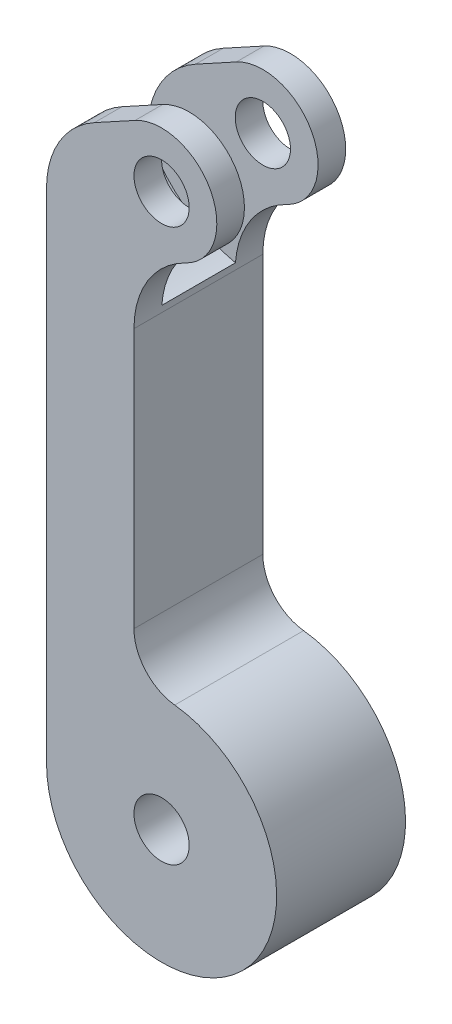
ISO-10303-21;
HEADER;
FILE_DESCRIPTION(('STEP AP214'),'2;1');
FILE_NAME('part.step','',(''),(''),'','','');
FILE_SCHEMA(('AUTOMOTIVE_DESIGN { 1 0 10303 214 1 1 1 1 }'));
ENDSEC;
DATA;
#1=APPLICATION_CONTEXT('core data for automotive mechanical design processes');
#2=APPLICATION_PROTOCOL_DEFINITION('international standard','automotive_design',2000,#1);
#3=PRODUCT_CONTEXT('',#1,'mechanical');
#4=PRODUCT('Part','Part','',(#3));
#5=PRODUCT_RELATED_PRODUCT_CATEGORY('part','',(#4));
#6=PRODUCT_DEFINITION_FORMATION('','',#4);
#7=PRODUCT_DEFINITION_CONTEXT('part definition',#1,'design');
#8=PRODUCT_DEFINITION('design','',#6,#7);
#9=PRODUCT_DEFINITION_SHAPE('','',#8);
#10=(LENGTH_UNIT() NAMED_UNIT(*) SI_UNIT(.MILLI.,.METRE.));
#11=(NAMED_UNIT(*) PLANE_ANGLE_UNIT() SI_UNIT($,.RADIAN.));
#12=(NAMED_UNIT(*) SI_UNIT($,.STERADIAN.) SOLID_ANGLE_UNIT());
#13=UNCERTAINTY_MEASURE_WITH_UNIT(LENGTH_MEASURE(1.E-05),#10,'distance_accuracy_value','');
#14=(GEOMETRIC_REPRESENTATION_CONTEXT(3) GLOBAL_UNCERTAINTY_ASSIGNED_CONTEXT((#13)) GLOBAL_UNIT_ASSIGNED_CONTEXT((#10,
#11,#12)) REPRESENTATION_CONTEXT('',''));
#15=CARTESIAN_POINT('',(0.,0.,0.));
#16=DIRECTION('',(0.,0.,1.));
#17=DIRECTION('',(1.,0.,0.));
#18=AXIS2_PLACEMENT_3D('',#15,#16,#17);
#19=CARTESIAN_POINT('',(0.,60.,14.));
#20=DIRECTION('',(0.,0.,-1.));
#21=DIRECTION('',(-1.,0.,0.));
#22=AXIS2_PLACEMENT_3D('',#19,#20,#21);
#23=CYLINDRICAL_SURFACE('',#22,6.);
#24=CARTESIAN_POINT('',(0.,60.,3.));
#25=DIRECTION('',(0.,0.,1.));
#26=DIRECTION('',(1.,0.,0.));
#27=AXIS2_PLACEMENT_3D('',#24,#25,#26);
#28=CIRCLE('',#27,6.);
#29=CARTESIAN_POINT('',(2.625,54.6046895362732,3.));
#30=VERTEX_POINT('',#29);
#31=CARTESIAN_POINT('',(-2.88,65.2636109278707,3.));
#32=VERTEX_POINT('',#31);
#33=EDGE_CURVE('E165',#30,#32,#28,.T.);
#34=ORIENTED_EDGE('',*,*,#33,.F.);
#35=DIRECTION('',(0.,0.,-1.));
#36=VECTOR('',#35,1.);
#37=CARTESIAN_POINT('',(2.625,54.6046895362732,14.));
#38=LINE('',#37,#36);
#39=CARTESIAN_POINT('',(2.625,54.6046895362732,0.));
#40=VERTEX_POINT('',#39);
#41=EDGE_CURVE('E233',#30,#40,#38,.T.);
#42=ORIENTED_EDGE('',*,*,#41,.T.);
#43=CARTESIAN_POINT('',(0.,60.,0.));
#44=DIRECTION('',(0.,0.,1.));
#45=DIRECTION('',(1.,0.,0.));
#46=AXIS2_PLACEMENT_3D('',#43,#44,#45);
#47=CIRCLE('',#46,6.);
#48=CARTESIAN_POINT('',(-2.88,65.2636109278707,0.));
#49=VERTEX_POINT('',#48);
#50=EDGE_CURVE('E204',#40,#49,#47,.T.);
#51=ORIENTED_EDGE('',*,*,#50,.T.);
#52=DIRECTION('',(0.,0.,-1.));
#53=VECTOR('',#52,1.);
#54=CARTESIAN_POINT('',(-2.88,65.2636109278707,14.));
#55=LINE('',#54,#53);
#56=EDGE_CURVE('E219',#32,#49,#55,.T.);
#57=ORIENTED_EDGE('',*,*,#56,.F.);
#58=EDGE_LOOP('',(#34,#42,#51,#57));
#59=FACE_BOUND('',#58,.T.);
#60=ADVANCED_FACE('F35',(#59),#23,.T.);
#61=CARTESIAN_POINT('',(-28.1453324537794,51.4396109278707,14.));
#62=DIRECTION('',(-0.48,0.877268487978452,0.));
#63=DIRECTION('',(-0.877268487978452,-0.48,0.));
#64=AXIS2_PLACEMENT_3D('',#61,#62,#63);
#65=PLANE('',#64);
#66=DIRECTION('',(0.,0.,-1.));
#67=VECTOR('',#66,1.);
#68=CARTESIAN_POINT('',(-7.3,62.8451950961463,14.));
#69=LINE('',#68,#67);
#70=CARTESIAN_POINT('',(-7.3,62.8451950961463,0.));
#71=VERTEX_POINT('',#70);
#72=CARTESIAN_POINT('',(-7.29999999999999,62.8451950961463,3.));
#73=VERTEX_POINT('',#72);
#74=EDGE_CURVE('E228',#71,#73,#69,.F.);
#75=ORIENTED_EDGE('',*,*,#74,.T.);
#76=DIRECTION('',(0.877268487978452,0.48,0.));
#77=VECTOR('',#76,1.);
#78=CARTESIAN_POINT('',(-28.1453324537794,51.4396109278707,3.));
#79=LINE('',#78,#77);
#80=EDGE_CURVE('E172',#73,#32,#79,.T.);
#81=ORIENTED_EDGE('',*,*,#80,.T.);
#82=ORIENTED_EDGE('',*,*,#56,.T.);
#83=DIRECTION('',(0.877268487978452,0.48,0.));
#84=VECTOR('',#83,1.);
#85=CARTESIAN_POINT('',(-28.1453324537794,51.4396109278707,0.));
#86=LINE('',#85,#84);
#87=EDGE_CURVE('E207',#71,#49,#86,.T.);
#88=ORIENTED_EDGE('',*,*,#87,.F.);
#89=EDGE_LOOP('',(#75,#81,#82,#88));
#90=FACE_BOUND('',#89,.T.);
#91=ADVANCED_FACE('F293',(#90),#65,.T.);
#92=CARTESIAN_POINT('',(0.,60.,14.));
#93=DIRECTION('',(0.,0.,-1.));
#94=DIRECTION('',(-1.,0.,0.));
#95=AXIS2_PLACEMENT_3D('',#92,#93,#94);
#96=CYLINDRICAL_SURFACE('',#95,3.);
#97=CARTESIAN_POINT('',(0.,60.,0.));
#98=DIRECTION('',(0.,0.,1.));
#99=DIRECTION('',(1.,0.,0.));
#100=AXIS2_PLACEMENT_3D('',#97,#98,#99);
#101=CIRCLE('',#100,3.);
#102=CARTESIAN_POINT('',(3.,60.,0.));
#103=VERTEX_POINT('',#102);
#104=EDGE_CURVE('E212',#103,#103,#101,.T.);
#105=ORIENTED_EDGE('',*,*,#104,.F.);
#106=EDGE_LOOP('',(#105));
#107=FACE_BOUND('',#106,.T.);
#108=CARTESIAN_POINT('',(0.,60.,3.));
#109=DIRECTION('',(0.,0.,1.));
#110=DIRECTION('',(1.,0.,0.));
#111=AXIS2_PLACEMENT_3D('',#108,#109,#110);
#112=CIRCLE('',#111,3.);
#113=CARTESIAN_POINT('',(3.,60.,3.));
#114=VERTEX_POINT('',#113);
#115=EDGE_CURVE('E149',#114,#114,#112,.T.);
#116=ORIENTED_EDGE('',*,*,#115,.T.);
#117=EDGE_LOOP('',(#116));
#118=FACE_BOUND('',#117,.T.);
#119=ADVANCED_FACE('F299',(#107,#118),#96,.F.);
#120=CARTESIAN_POINT('',(-12.5,0.,14.));
#121=DIRECTION('',(1.,0.,0.));
#122=DIRECTION('',(0.,1.,0.));
#123=AXIS2_PLACEMENT_3D('',#120,#121,#122);
#124=PLANE('',#123);
#125=DIRECTION('',(0.,-1.,0.));
#126=VECTOR('',#125,1.);
#127=CARTESIAN_POINT('',(-12.5,0.,3.));
#128=LINE('',#127,#126);
#129=CARTESIAN_POINT('',(-12.5,54.0725102163618,3.));
#130=VERTEX_POINT('',#129);
#131=CARTESIAN_POINT('',(-12.5,53.6952398935408,3.));
#132=VERTEX_POINT('',#131);
#133=EDGE_CURVE('E178',#130,#132,#128,.T.);
#134=ORIENTED_EDGE('',*,*,#133,.F.);
#135=DIRECTION('',(0.,0.,-1.));
#136=VECTOR('',#135,1.);
#137=CARTESIAN_POINT('',(-12.5,54.0725102163618,0.));
#138=LINE('',#137,#136);
#139=CARTESIAN_POINT('',(-12.5,54.0725102163618,0.));
#140=VERTEX_POINT('',#139);
#141=EDGE_CURVE('E223',#130,#140,#138,.T.);
#142=ORIENTED_EDGE('',*,*,#141,.T.);
#143=DIRECTION('',(0.,-1.,0.));
#144=VECTOR('',#143,1.);
#145=CARTESIAN_POINT('',(-12.5,0.,0.));
#146=LINE('',#145,#144);
#147=CARTESIAN_POINT('',(-12.5,0.,0.));
#148=VERTEX_POINT('',#147);
#149=EDGE_CURVE('E210',#140,#148,#146,.T.);
#150=ORIENTED_EDGE('',*,*,#149,.T.);
#151=DIRECTION('',(0.,0.,-1.));
#152=VECTOR('',#151,1.);
#153=CARTESIAN_POINT('',(-12.5,0.,14.));
#154=LINE('',#153,#152);
#155=CARTESIAN_POINT('',(-12.5,0.,14.));
#156=VERTEX_POINT('',#155);
#157=EDGE_CURVE('E200',#156,#148,#154,.T.);
#158=ORIENTED_EDGE('',*,*,#157,.F.);
#159=DIRECTION('',(0.,-1.,0.));
#160=VECTOR('',#159,1.);
#161=CARTESIAN_POINT('',(-12.5,0.,14.));
#162=LINE('',#161,#160);
#163=CARTESIAN_POINT('',(-12.5,54.0725102163618,14.));
#164=VERTEX_POINT('',#163);
#165=EDGE_CURVE('E192',#164,#156,#162,.T.);
#166=ORIENTED_EDGE('',*,*,#165,.F.);
#167=CARTESIAN_POINT('',(-12.5,54.0725102163618,11.));
#168=VERTEX_POINT('',#167);
#169=EDGE_CURVE('E160',#164,#168,#138,.T.);
#170=ORIENTED_EDGE('',*,*,#169,.T.);
#171=DIRECTION('',(0.,-1.,0.));
#172=VECTOR('',#171,1.);
#173=CARTESIAN_POINT('',(-12.5,0.,11.));
#174=LINE('',#173,#172);
#175=CARTESIAN_POINT('',(-12.5,53.6952398935408,11.));
#176=VERTEX_POINT('',#175);
#177=EDGE_CURVE('E152',#168,#176,#174,.T.);
#178=ORIENTED_EDGE('',*,*,#177,.T.);
#179=DIRECTION('',(0.,0.,1.));
#180=VECTOR('',#179,1.);
#181=CARTESIAN_POINT('',(-12.5,53.6952398935408,3.));
#182=LINE('',#181,#180);
#183=EDGE_CURVE('E138',#176,#132,#182,.F.);
#184=ORIENTED_EDGE('',*,*,#183,.T.);
#185=EDGE_LOOP('',(#134,#142,#150,#158,#166,#170,#178,#184));
#186=FACE_BOUND('',#185,.T.);
#187=ADVANCED_FACE('F157',(#186),#124,.F.);
#188=CARTESIAN_POINT('',(-2.5,54.0725102163618,14.));
#189=DIRECTION('',(0.,0.,1.));
#190=DIRECTION('',(1.,0.,0.));
#191=AXIS2_PLACEMENT_3D('',#188,#189,#190);
#192=CYLINDRICAL_SURFACE('',#191,10.);
#193=ORIENTED_EDGE('',*,*,#141,.F.);
#194=CARTESIAN_POINT('',(-2.5,54.0725102163618,3.));
#195=DIRECTION('',(0.,0.,1.));
#196=DIRECTION('',(1.,0.,0.));
#197=AXIS2_PLACEMENT_3D('',#194,#195,#196);
#198=CIRCLE('',#197,10.);
#199=EDGE_CURVE('E175',#130,#73,#198,.F.);
#200=ORIENTED_EDGE('',*,*,#199,.T.);
#201=ORIENTED_EDGE('',*,*,#74,.F.);
#202=CARTESIAN_POINT('',(-2.5,54.0725102163618,0.));
#203=DIRECTION('',(0.,0.,1.));
#204=DIRECTION('',(1.,0.,0.));
#205=AXIS2_PLACEMENT_3D('',#202,#203,#204);
#206=CIRCLE('',#205,10.);
#207=EDGE_CURVE('E225',#140,#71,#206,.F.);
#208=ORIENTED_EDGE('',*,*,#207,.F.);
#209=EDGE_LOOP('',(#193,#200,#201,#208));
#210=FACE_BOUND('',#209,.T.);
#211=ADVANCED_FACE('F281',(#210),#192,.T.);
#212=CARTESIAN_POINT('',(7.,45.6125054300618,14.));
#213=DIRECTION('',(0.,0.,-1.));
#214=DIRECTION('',(-1.,0.,0.));
#215=AXIS2_PLACEMENT_3D('',#212,#213,#214);
#216=CYLINDRICAL_SURFACE('',#215,10.);
#217=CARTESIAN_POINT('',(7.,45.6125054300618,3.));
#218=DIRECTION('',(0.,0.,1.));
#219=DIRECTION('',(1.,0.,0.));
#220=AXIS2_PLACEMENT_3D('',#217,#218,#219);
#221=CIRCLE('',#220,10.);
#222=CARTESIAN_POINT('',(-2.9749598714857,46.3197363416106,3.));
#223=VERTEX_POINT('',#222);
#224=EDGE_CURVE('E11',#223,#30,#221,.F.);
#225=ORIENTED_EDGE('',*,*,#224,.F.);
#226=DIRECTION('',(0.,0.,1.));
#227=VECTOR('',#226,1.);
#228=CARTESIAN_POINT('',(-2.9749598714857,46.3197363416106,7.));
#229=LINE('',#228,#227);
#230=CARTESIAN_POINT('',(-2.9749598714857,46.3197363416106,11.));
#231=VERTEX_POINT('',#230);
#232=EDGE_CURVE('E43',#223,#231,#229,.T.);
#233=ORIENTED_EDGE('',*,*,#232,.T.);
#234=CARTESIAN_POINT('',(7.,45.6125054300618,11.));
#235=DIRECTION('',(0.,0.,1.));
#236=DIRECTION('',(1.,0.,0.));
#237=AXIS2_PLACEMENT_3D('',#234,#235,#236);
#238=CIRCLE('',#237,10.);
#239=CARTESIAN_POINT('',(2.625,54.6046895362732,11.));
#240=VERTEX_POINT('',#239);
#241=EDGE_CURVE('E154',#231,#240,#238,.F.);
#242=ORIENTED_EDGE('',*,*,#241,.T.);
#243=CARTESIAN_POINT('',(2.625,54.6046895362732,14.));
#244=VERTEX_POINT('',#243);
#245=EDGE_CURVE('E234',#244,#240,#38,.T.);
#246=ORIENTED_EDGE('',*,*,#245,.F.);
#247=CARTESIAN_POINT('',(7.,45.6125054300618,14.));
#248=DIRECTION('',(0.,0.,1.));
#249=DIRECTION('',(1.,0.,0.));
#250=AXIS2_PLACEMENT_3D('',#247,#248,#249);
#251=CIRCLE('',#250,10.);
#252=CARTESIAN_POINT('',(-3.,45.6125054300618,14.));
#253=VERTEX_POINT('',#252);
#254=EDGE_CURVE('E243',#253,#244,#251,.F.);
#255=ORIENTED_EDGE('',*,*,#254,.F.);
#256=DIRECTION('',(0.,0.,1.));
#257=VECTOR('',#256,1.);
#258=CARTESIAN_POINT('',(-3.,45.6125054300618,14.));
#259=LINE('',#258,#257);
#260=CARTESIAN_POINT('',(-3.,45.6125054300618,0.));
#261=VERTEX_POINT('',#260);
#262=EDGE_CURVE('E237',#261,#253,#259,.T.);
#263=ORIENTED_EDGE('',*,*,#262,.F.);
#264=CARTESIAN_POINT('',(7.,45.6125054300618,0.));
#265=DIRECTION('',(0.,0.,1.));
#266=DIRECTION('',(1.,0.,0.));
#267=AXIS2_PLACEMENT_3D('',#264,#265,#266);
#268=CIRCLE('',#267,10.);
#269=EDGE_CURVE('E240',#40,#261,#268,.T.);
#270=ORIENTED_EDGE('',*,*,#269,.F.);
#271=ORIENTED_EDGE('',*,*,#41,.F.);
#272=EDGE_LOOP('',(#225,#233,#242,#246,#255,#263,#270,#271));
#273=FACE_BOUND('',#272,.T.);
#274=ADVANCED_FACE('F255',(#273),#216,.F.);
#275=CARTESIAN_POINT('',(0.,0.,14.));
#276=DIRECTION('',(0.,0.,-1.));
#277=DIRECTION('',(-1.,0.,0.));
#278=AXIS2_PLACEMENT_3D('',#275,#276,#277);
#279=CYLINDRICAL_SURFACE('',#278,12.5);
#280=CARTESIAN_POINT('',(0.,0.,0.));
#281=DIRECTION('',(0.,0.,1.));
#282=DIRECTION('',(1.,0.,0.));
#283=AXIS2_PLACEMENT_3D('',#280,#281,#282);
#284=CIRCLE('',#283,12.5);
#285=CARTESIAN_POINT('',(1.42857142857143,12.4180990362241,0.));
#286=VERTEX_POINT('',#285);
#287=EDGE_CURVE('E148',#148,#286,#284,.T.);
#288=ORIENTED_EDGE('',*,*,#287,.T.);
#289=DIRECTION('',(0.,0.,-1.));
#290=VECTOR('',#289,1.);
#291=CARTESIAN_POINT('',(1.42857142857143,12.4180990362241,14.));
#292=LINE('',#291,#290);
#293=CARTESIAN_POINT('',(1.42857142857143,12.4180990362241,14.));
#294=VERTEX_POINT('',#293);
#295=EDGE_CURVE('E58',#286,#294,#292,.F.);
#296=ORIENTED_EDGE('',*,*,#295,.T.);
#297=CARTESIAN_POINT('',(0.,0.,14.));
#298=DIRECTION('',(0.,0.,1.));
#299=DIRECTION('',(1.,0.,0.));
#300=AXIS2_PLACEMENT_3D('',#297,#298,#299);
#301=CIRCLE('',#300,12.5);
#302=EDGE_CURVE('E182',#156,#294,#301,.T.);
#303=ORIENTED_EDGE('',*,*,#302,.F.);
#304=ORIENTED_EDGE('',*,*,#157,.T.);
#305=EDGE_LOOP('',(#288,#296,#303,#304));
#306=FACE_BOUND('',#305,.T.);
#307=ADVANCED_FACE('F310',(#306),#279,.T.);
#308=CARTESIAN_POINT('',(-3.,0.,14.));
#309=DIRECTION('',(-1.,0.,0.));
#310=DIRECTION('',(0.,-1.,0.));
#311=AXIS2_PLACEMENT_3D('',#308,#309,#310);
#312=PLANE('',#311);
#313=DIRECTION('',(0.,1.,0.));
#314=VECTOR('',#313,1.);
#315=CARTESIAN_POINT('',(-3.,0.,14.));
#316=LINE('',#315,#314);
#317=CARTESIAN_POINT('',(-3.,17.3853386507137,14.));
#318=VERTEX_POINT('',#317);
#319=EDGE_CURVE('E184',#318,#253,#316,.T.);
#320=ORIENTED_EDGE('',*,*,#319,.F.);
#321=DIRECTION('',(0.,0.,1.));
#322=VECTOR('',#321,1.);
#323=CARTESIAN_POINT('',(-3.,17.3853386507137,0.));
#324=LINE('',#323,#322);
#325=CARTESIAN_POINT('',(-3.,17.3853386507137,0.));
#326=VERTEX_POINT('',#325);
#327=EDGE_CURVE('E245',#318,#326,#324,.F.);
#328=ORIENTED_EDGE('',*,*,#327,.T.);
#329=DIRECTION('',(0.,1.,0.));
#330=VECTOR('',#329,1.);
#331=CARTESIAN_POINT('',(-3.,0.,0.));
#332=LINE('',#331,#330);
#333=EDGE_CURVE('E202',#326,#261,#332,.T.);
#334=ORIENTED_EDGE('',*,*,#333,.T.);
#335=ORIENTED_EDGE('',*,*,#262,.T.);
#336=EDGE_LOOP('',(#320,#328,#334,#335));
#337=FACE_BOUND('',#336,.T.);
#338=ADVANCED_FACE('F304',(#337),#312,.F.);
#339=ORIENTED_EDGE('',*,*,#245,.T.);
#340=CARTESIAN_POINT('',(0.,60.,11.));
#341=DIRECTION('',(0.,0.,1.));
#342=DIRECTION('',(1.,0.,0.));
#343=AXIS2_PLACEMENT_3D('',#340,#341,#342);
#344=CIRCLE('',#343,6.);
#345=CARTESIAN_POINT('',(-2.88,65.2636109278707,11.));
#346=VERTEX_POINT('',#345);
#347=EDGE_CURVE('E50',#240,#346,#344,.T.);
#348=ORIENTED_EDGE('',*,*,#347,.T.);
#349=CARTESIAN_POINT('',(-2.88,65.2636109278707,14.));
#350=VERTEX_POINT('',#349);
#351=EDGE_CURVE('E220',#350,#346,#55,.T.);
#352=ORIENTED_EDGE('',*,*,#351,.F.);
#353=CARTESIAN_POINT('',(0.,60.,14.));
#354=DIRECTION('',(0.,0.,1.));
#355=DIRECTION('',(1.,0.,0.));
#356=AXIS2_PLACEMENT_3D('',#353,#354,#355);
#357=CIRCLE('',#356,6.);
#358=EDGE_CURVE('E187',#244,#350,#357,.T.);
#359=ORIENTED_EDGE('',*,*,#358,.F.);
#360=EDGE_LOOP('',(#339,#348,#352,#359));
#361=FACE_BOUND('',#360,.T.);
#362=ADVANCED_FACE('F268',(#361),#23,.T.);
#363=DIRECTION('',(0.877268487978452,0.48,0.));
#364=VECTOR('',#363,1.);
#365=CARTESIAN_POINT('',(-28.1453324537794,51.4396109278707,11.));
#366=LINE('',#365,#364);
#367=CARTESIAN_POINT('',(-7.29999999999999,62.8451950961463,11.));
#368=VERTEX_POINT('',#367);
#369=EDGE_CURVE('E167',#368,#346,#366,.T.);
#370=ORIENTED_EDGE('',*,*,#369,.F.);
#371=CARTESIAN_POINT('',(-7.3,62.8451950961463,14.));
#372=VERTEX_POINT('',#371);
#373=EDGE_CURVE('E227',#368,#372,#69,.F.);
#374=ORIENTED_EDGE('',*,*,#373,.T.);
#375=DIRECTION('',(0.877268487978452,0.48,0.));
#376=VECTOR('',#375,1.);
#377=CARTESIAN_POINT('',(-28.1453324537794,51.4396109278707,14.));
#378=LINE('',#377,#376);
#379=EDGE_CURVE('E189',#372,#350,#378,.T.);
#380=ORIENTED_EDGE('',*,*,#379,.T.);
#381=ORIENTED_EDGE('',*,*,#351,.T.);
#382=EDGE_LOOP('',(#370,#374,#380,#381));
#383=FACE_BOUND('',#382,.T.);
#384=ADVANCED_FACE('F270',(#383),#65,.T.);
#385=CARTESIAN_POINT('',(0.,60.,11.));
#386=DIRECTION('',(0.,0.,1.));
#387=DIRECTION('',(1.,0.,0.));
#388=AXIS2_PLACEMENT_3D('',#385,#386,#387);
#389=CIRCLE('',#388,3.);
#390=CARTESIAN_POINT('',(3.,60.,11.));
#391=VERTEX_POINT('',#390);
#392=EDGE_CURVE('E161',#391,#391,#389,.T.);
#393=ORIENTED_EDGE('',*,*,#392,.F.);
#394=EDGE_LOOP('',(#393));
#395=FACE_BOUND('',#394,.T.);
#396=CARTESIAN_POINT('',(0.,60.,14.));
#397=DIRECTION('',(0.,0.,1.));
#398=DIRECTION('',(1.,0.,0.));
#399=AXIS2_PLACEMENT_3D('',#396,#397,#398);
#400=CIRCLE('',#399,3.);
#401=CARTESIAN_POINT('',(3.,60.,14.));
#402=VERTEX_POINT('',#401);
#403=EDGE_CURVE('E194',#402,#402,#400,.T.);
#404=ORIENTED_EDGE('',*,*,#403,.T.);
#405=EDGE_LOOP('',(#404));
#406=FACE_BOUND('',#405,.T.);
#407=ADVANCED_FACE('F309',(#395,#406),#96,.F.);
#408=CARTESIAN_POINT('',(0.,0.,14.));
#409=DIRECTION('',(0.,0.,-1.));
#410=DIRECTION('',(-1.,0.,0.));
#411=AXIS2_PLACEMENT_3D('',#408,#409,#410);
#412=CYLINDRICAL_SURFACE('',#411,3.);
#413=CARTESIAN_POINT('',(0.,0.,14.));
#414=DIRECTION('',(0.,0.,1.));
#415=DIRECTION('',(1.,0.,0.));
#416=AXIS2_PLACEMENT_3D('',#413,#414,#415);
#417=CIRCLE('',#416,3.);
#418=CARTESIAN_POINT('',(3.,0.,14.));
#419=VERTEX_POINT('',#418);
#420=EDGE_CURVE('E197',#419,#419,#417,.T.);
#421=ORIENTED_EDGE('',*,*,#420,.T.);
#422=EDGE_LOOP('',(#421));
#423=FACE_BOUND('',#422,.T.);
#424=CARTESIAN_POINT('',(0.,0.,0.));
#425=DIRECTION('',(0.,0.,1.));
#426=DIRECTION('',(1.,0.,0.));
#427=AXIS2_PLACEMENT_3D('',#424,#425,#426);
#428=CIRCLE('',#427,3.);
#429=CARTESIAN_POINT('',(3.,0.,0.));
#430=VERTEX_POINT('',#429);
#431=EDGE_CURVE('E185',#430,#430,#428,.T.);
#432=ORIENTED_EDGE('',*,*,#431,.F.);
#433=EDGE_LOOP('',(#432));
#434=FACE_BOUND('',#433,.T.);
#435=ADVANCED_FACE('F336',(#423,#434),#412,.F.);
#436=CARTESIAN_POINT('',(0.,0.,14.));
#437=DIRECTION('',(0.,0.,1.));
#438=DIRECTION('',(1.,0.,0.));
#439=AXIS2_PLACEMENT_3D('',#436,#437,#438);
#440=PLANE('',#439);
#441=ORIENTED_EDGE('',*,*,#379,.F.);
#442=CARTESIAN_POINT('',(-2.5,54.0725102163618,14.));
#443=DIRECTION('',(0.,0.,1.));
#444=DIRECTION('',(1.,0.,0.));
#445=AXIS2_PLACEMENT_3D('',#442,#443,#444);
#446=CIRCLE('',#445,10.);
#447=EDGE_CURVE('E231',#372,#164,#446,.T.);
#448=ORIENTED_EDGE('',*,*,#447,.T.);
#449=ORIENTED_EDGE('',*,*,#165,.T.);
#450=ORIENTED_EDGE('',*,*,#302,.T.);
#451=CARTESIAN_POINT('',(2.,17.3853386507137,14.));
#452=DIRECTION('',(0.,0.,1.));
#453=DIRECTION('',(1.,0.,0.));
#454=AXIS2_PLACEMENT_3D('',#451,#452,#453);
#455=CIRCLE('',#454,5.);
#456=EDGE_CURVE('E251',#294,#318,#455,.F.);
#457=ORIENTED_EDGE('',*,*,#456,.T.);
#458=ORIENTED_EDGE('',*,*,#319,.T.);
#459=ORIENTED_EDGE('',*,*,#254,.T.);
#460=ORIENTED_EDGE('',*,*,#358,.T.);
#461=EDGE_LOOP('',(#441,#448,#449,#450,#457,#458,#459,#460));
#462=FACE_BOUND('',#461,.T.);
#463=ORIENTED_EDGE('',*,*,#403,.F.);
#464=EDGE_LOOP('',(#463));
#465=FACE_BOUND('',#464,.T.);
#466=ORIENTED_EDGE('',*,*,#420,.F.);
#467=EDGE_LOOP('',(#466));
#468=FACE_BOUND('',#467,.T.);
#469=ADVANCED_FACE('F274',(#462,#465,#468),#440,.T.);
#470=CARTESIAN_POINT('',(0.,0.,0.));
#471=DIRECTION('',(0.,0.,1.));
#472=DIRECTION('',(1.,0.,0.));
#473=AXIS2_PLACEMENT_3D('',#470,#471,#472);
#474=PLANE('',#473);
#475=ORIENTED_EDGE('',*,*,#149,.F.);
#476=ORIENTED_EDGE('',*,*,#207,.T.);
#477=ORIENTED_EDGE('',*,*,#87,.T.);
#478=ORIENTED_EDGE('',*,*,#50,.F.);
#479=ORIENTED_EDGE('',*,*,#269,.T.);
#480=ORIENTED_EDGE('',*,*,#333,.F.);
#481=CARTESIAN_POINT('',(2.,17.3853386507137,0.));
#482=DIRECTION('',(0.,0.,1.));
#483=DIRECTION('',(1.,0.,0.));
#484=AXIS2_PLACEMENT_3D('',#481,#482,#483);
#485=CIRCLE('',#484,5.);
#486=EDGE_CURVE('E249',#326,#286,#485,.T.);
#487=ORIENTED_EDGE('',*,*,#486,.T.);
#488=ORIENTED_EDGE('',*,*,#287,.F.);
#489=EDGE_LOOP('',(#475,#476,#477,#478,#479,#480,#487,#488));
#490=FACE_BOUND('',#489,.T.);
#491=ORIENTED_EDGE('',*,*,#104,.T.);
#492=EDGE_LOOP('',(#491));
#493=FACE_BOUND('',#492,.T.);
#494=ORIENTED_EDGE('',*,*,#431,.T.);
#495=EDGE_LOOP('',(#494));
#496=FACE_BOUND('',#495,.T.);
#497=ADVANCED_FACE('F279',(#490,#493,#496),#474,.F.);
#498=CARTESIAN_POINT('',(-2.5,54.0725102163618,11.));
#499=DIRECTION('',(0.,0.,1.));
#500=DIRECTION('',(1.,0.,0.));
#501=AXIS2_PLACEMENT_3D('',#498,#499,#500);
#502=CIRCLE('',#501,10.);
#503=EDGE_CURVE('E162',#168,#368,#502,.F.);
#504=ORIENTED_EDGE('',*,*,#503,.F.);
#505=ORIENTED_EDGE('',*,*,#169,.F.);
#506=ORIENTED_EDGE('',*,*,#447,.F.);
#507=ORIENTED_EDGE('',*,*,#373,.F.);
#508=EDGE_LOOP('',(#504,#505,#506,#507));
#509=FACE_BOUND('',#508,.T.);
#510=ADVANCED_FACE('F277',(#509),#192,.T.);
#511=CARTESIAN_POINT('',(2.,17.3853386507137,14.));
#512=DIRECTION('',(0.,0.,-1.));
#513=DIRECTION('',(-1.,0.,0.));
#514=AXIS2_PLACEMENT_3D('',#511,#512,#513);
#515=CYLINDRICAL_SURFACE('',#514,5.);
#516=ORIENTED_EDGE('',*,*,#456,.F.);
#517=ORIENTED_EDGE('',*,*,#295,.F.);
#518=ORIENTED_EDGE('',*,*,#486,.F.);
#519=ORIENTED_EDGE('',*,*,#327,.F.);
#520=EDGE_LOOP('',(#516,#517,#518,#519));
#521=FACE_BOUND('',#520,.T.);
#522=ADVANCED_FACE('F37',(#521),#515,.F.);
#523=CARTESIAN_POINT('',(0.,60.,3.));
#524=DIRECTION('',(0.,0.,1.));
#525=DIRECTION('',(1.,0.,0.));
#526=AXIS2_PLACEMENT_3D('',#523,#524,#525);
#527=CYLINDRICAL_SURFACE('',#526,14.);
#528=CARTESIAN_POINT('',(0.,60.,11.));
#529=DIRECTION('',(0.,0.,1.));
#530=DIRECTION('',(1.,0.,0.));
#531=AXIS2_PLACEMENT_3D('',#528,#529,#530);
#532=CIRCLE('',#531,14.);
#533=EDGE_CURVE('E141',#176,#231,#532,.T.);
#534=ORIENTED_EDGE('',*,*,#533,.T.);
#535=ORIENTED_EDGE('',*,*,#232,.F.);
#536=CARTESIAN_POINT('',(0.,60.,3.));
#537=DIRECTION('',(0.,0.,1.));
#538=DIRECTION('',(1.,0.,0.));
#539=AXIS2_PLACEMENT_3D('',#536,#537,#538);
#540=CIRCLE('',#539,14.);
#541=EDGE_CURVE('E144',#132,#223,#540,.T.);
#542=ORIENTED_EDGE('',*,*,#541,.F.);
#543=ORIENTED_EDGE('',*,*,#183,.F.);
#544=EDGE_LOOP('',(#534,#535,#542,#543));
#545=FACE_BOUND('',#544,.T.);
#546=ADVANCED_FACE('F140',(#545),#527,.F.);
#547=CARTESIAN_POINT('',(0.,60.,3.));
#548=DIRECTION('',(0.,0.,1.));
#549=DIRECTION('',(1.,0.,0.));
#550=AXIS2_PLACEMENT_3D('',#547,#548,#549);
#551=PLANE('',#550);
#552=ORIENTED_EDGE('',*,*,#115,.F.);
#553=EDGE_LOOP('',(#552));
#554=FACE_BOUND('',#553,.T.);
#555=ORIENTED_EDGE('',*,*,#133,.T.);
#556=ORIENTED_EDGE('',*,*,#541,.T.);
#557=ORIENTED_EDGE('',*,*,#224,.T.);
#558=ORIENTED_EDGE('',*,*,#33,.T.);
#559=ORIENTED_EDGE('',*,*,#80,.F.);
#560=ORIENTED_EDGE('',*,*,#199,.F.);
#561=EDGE_LOOP('',(#555,#556,#557,#558,#559,#560));
#562=FACE_BOUND('',#561,.T.);
#563=ADVANCED_FACE('F259',(#554,#562),#551,.T.);
#564=CARTESIAN_POINT('',(0.,60.,11.));
#565=DIRECTION('',(0.,0.,1.));
#566=DIRECTION('',(1.,0.,0.));
#567=AXIS2_PLACEMENT_3D('',#564,#565,#566);
#568=PLANE('',#567);
#569=ORIENTED_EDGE('',*,*,#392,.T.);
#570=EDGE_LOOP('',(#569));
#571=FACE_BOUND('',#570,.T.);
#572=ORIENTED_EDGE('',*,*,#503,.T.);
#573=ORIENTED_EDGE('',*,*,#369,.T.);
#574=ORIENTED_EDGE('',*,*,#347,.F.);
#575=ORIENTED_EDGE('',*,*,#241,.F.);
#576=ORIENTED_EDGE('',*,*,#533,.F.);
#577=ORIENTED_EDGE('',*,*,#177,.F.);
#578=EDGE_LOOP('',(#572,#573,#574,#575,#576,#577));
#579=FACE_BOUND('',#578,.T.);
#580=ADVANCED_FACE('F151',(#571,#579),#568,.F.);
#581=CLOSED_SHELL('',(#60,#91,#119,#187,#211,#274,#307,#338,#362,#384,#407,#435,#469,#497,#510,
#522,#546,#563,#580));
#582=MANIFOLD_SOLID_BREP('B2',#581);
#583=ADVANCED_BREP_SHAPE_REPRESENTATION('',(#18,#582),#14);
#584=SHAPE_DEFINITION_REPRESENTATION(#9,#583);
ENDSEC;
END-ISO-10303-21;
